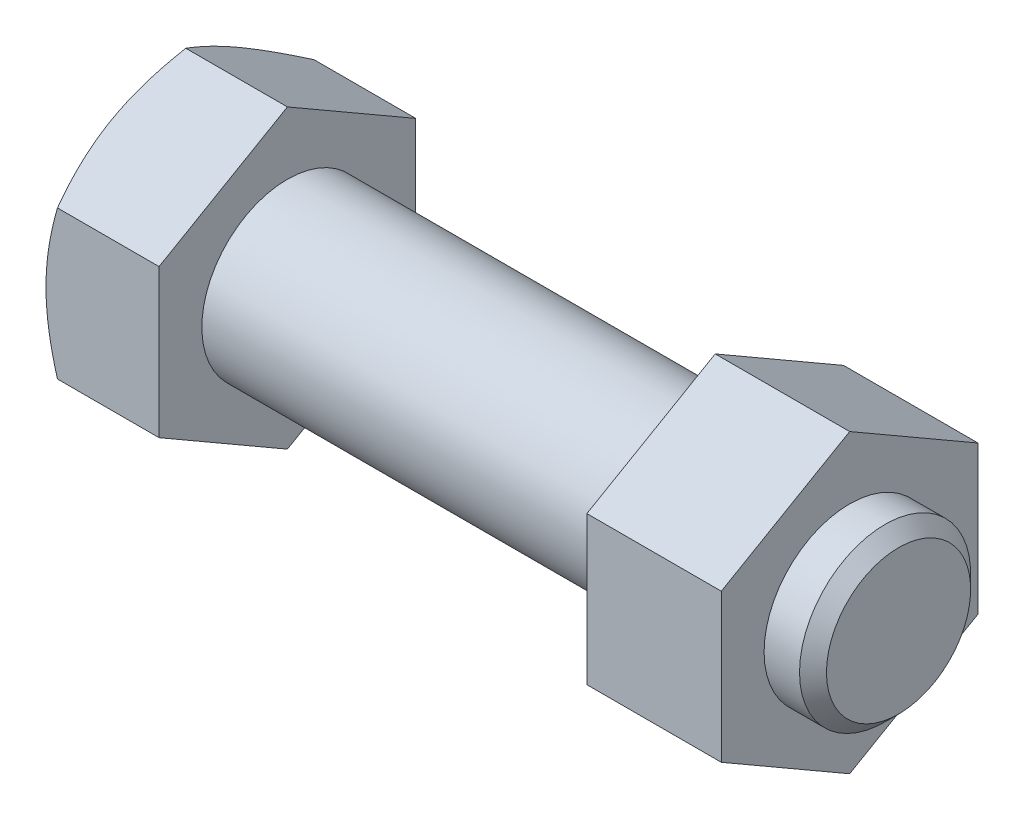
ISO-10303-21;
HEADER;
FILE_DESCRIPTION(('STEP AP214'),'2;1');
FILE_NAME('part.step','',(''),(''),'','','');
FILE_SCHEMA(('AUTOMOTIVE_DESIGN { 1 0 10303 214 1 1 1 1 }'));
ENDSEC;
DATA;
#1=APPLICATION_CONTEXT('core data for automotive mechanical design processes');
#2=APPLICATION_PROTOCOL_DEFINITION('international standard','automotive_design',2000,#1);
#3=PRODUCT_CONTEXT('',#1,'mechanical');
#4=PRODUCT('Part','Part','',(#3));
#5=PRODUCT_RELATED_PRODUCT_CATEGORY('part','',(#4));
#6=PRODUCT_DEFINITION_FORMATION('','',#4);
#7=PRODUCT_DEFINITION_CONTEXT('part definition',#1,'design');
#8=PRODUCT_DEFINITION('design','',#6,#7);
#9=PRODUCT_DEFINITION_SHAPE('','',#8);
#10=(LENGTH_UNIT() NAMED_UNIT(*) SI_UNIT(.MILLI.,.METRE.));
#11=(NAMED_UNIT(*) PLANE_ANGLE_UNIT() SI_UNIT($,.RADIAN.));
#12=(NAMED_UNIT(*) SI_UNIT($,.STERADIAN.) SOLID_ANGLE_UNIT());
#13=UNCERTAINTY_MEASURE_WITH_UNIT(LENGTH_MEASURE(1.E-05),#10,'distance_accuracy_value','');
#14=(GEOMETRIC_REPRESENTATION_CONTEXT(3) GLOBAL_UNCERTAINTY_ASSIGNED_CONTEXT((#13)) GLOBAL_UNIT_ASSIGNED_CONTEXT((#10,
#11,#12)) REPRESENTATION_CONTEXT('',''));
#15=CARTESIAN_POINT('',(0.,0.,0.));
#16=DIRECTION('',(0.,0.,1.));
#17=DIRECTION('',(1.,0.,0.));
#18=AXIS2_PLACEMENT_3D('',#15,#16,#17);
#19=CARTESIAN_POINT('',(0.,0.,0.));
#20=DIRECTION('',(-1.,0.,0.));
#21=DIRECTION('',(0.,0.,1.00000000000005));
#22=AXIS2_PLACEMENT_3D('',#19,#20,#21);
#23=CYLINDRICAL_SURFACE('',#22,7.);
#24=CARTESIAN_POINT('',(9.24999999999998,-1.33226762955019E-12,9.71445146547012E-13));
#25=DIRECTION('',(1.,0.,0.));
#26=DIRECTION('',(0.,0.,-1.00000000000005));
#27=AXIS2_PLACEMENT_3D('',#24,#25,#26);
#28=CIRCLE('',#27,7.);
#29=CARTESIAN_POINT('',(9.24999999999998,-1.53393964197335E-12,-6.99999999999936));
#30=VERTEX_POINT('',#29);
#31=EDGE_CURVE('E276',#30,#30,#28,.F.);
#32=ORIENTED_EDGE('',*,*,#31,.F.);
#33=EDGE_LOOP('',(#32));
#34=FACE_BOUND('',#33,.T.);
#35=CARTESIAN_POINT('',(44.2499999999999,-1.13797860024079E-12,1.83186799063151E-12));
#36=DIRECTION('',(1.,0.,0.));
#37=DIRECTION('',(0.,1.00000000000003,0.));
#38=AXIS2_PLACEMENT_3D('',#35,#36,#37);
#39=CIRCLE('',#38,7.);
#40=CARTESIAN_POINT('',(44.2499999999999,6.99999999999906,2.02421412964782E-12));
#41=VERTEX_POINT('',#40);
#42=EDGE_CURVE('E11',#41,#41,#39,.T.);
#43=ORIENTED_EDGE('',*,*,#42,.F.);
#44=EDGE_LOOP('',(#43));
#45=FACE_BOUND('',#44,.T.);
#46=ADVANCED_FACE('F34',(#34,#45),#23,.T.);
#47=CARTESIAN_POINT('',(9.24999999999221,6.06217782648963,-10.4999999999995));
#48=DIRECTION('',(0.,-0.866025403784438,0.500000000000001));
#49=DIRECTION('',(0.,-0.50000000000004,-0.866025403784497));
#50=AXIS2_PLACEMENT_3D('',#47,#48,#49);
#51=PLANE('',#50);
#52=CARTESIAN_POINT('',(0.937888841127998,12.1244711230351,0.000200000001032707));
#53=CARTESIAN_POINT('',(0.860963916074536,11.9912113022024,-0.230612780288469));
#54=CARTESIAN_POINT('',(0.78753038305219,11.857454619267,-0.462286150984406));
#55=CARTESIAN_POINT('',(0.648614855968593,11.5888686248672,-0.927490739486239));
#56=CARTESIAN_POINT('',(0.583135477152079,11.4540389760643,-1.16102254157951));
#57=CARTESIAN_POINT('',(0.399895760204819,11.047377522337,-1.86538084091498));
#58=CARTESIAN_POINT('',(0.295669956057004,10.7739403689782,-2.33898788320942));
#59=CARTESIAN_POINT('',(0.173455649414797,10.3647541884673,-3.04771913760934));
#60=CARTESIAN_POINT('',(0.138641420004542,10.2302276268788,-3.28072597724818));
#61=CARTESIAN_POINT('',(0.0802602632081069,9.96055165836782,-3.74781845628953));
#62=CARTESIAN_POINT('',(0.0566935523018715,9.82540223950779,-3.98190411636847));
#63=CARTESIAN_POINT('',(0.0214112687989164,9.55487796759049,-4.45046590000994));
#64=CARTESIAN_POINT('',(0.00968161306869788,9.41950357481841,-4.68494122633517));
#65=CARTESIAN_POINT('',(-0.00167731742442949,9.1486297507214,-5.15410845211112));
#66=CARTESIAN_POINT('',(-0.00130696605000955,9.01313032338912,-5.38880034464639));
#67=CARTESIAN_POINT('',(0.0106922674925709,8.75981159789982,-5.82756124770255));
#68=CARTESIAN_POINT('',(0.0208573916334624,8.64197441901355,-6.03166122855481));
#69=CARTESIAN_POINT('',(0.0501416022106179,8.40657565829971,-6.43938384215042));
#70=CARTESIAN_POINT('',(0.0692613220244534,8.28901409655837,-6.6430064401034));
#71=CARTESIAN_POINT('',(0.139600342171741,7.93678493717226,-7.25308524006716));
#72=CARTESIAN_POINT('',(0.203790739707198,7.70274080802523,-7.65846156296314));
#73=CARTESIAN_POINT('',(0.364267089687421,7.23216993554886,-8.47351422265434));
#74=CARTESIAN_POINT('',(0.461233267874081,6.99570324614058,-8.88308654300709));
#75=CARTESIAN_POINT('',(0.681306134880185,6.52629611674948,-9.69612354054741));
#76=CARTESIAN_POINT('',(0.80436113727997,6.29334966603523,-10.0995986286272));
#77=CARTESIAN_POINT('',(0.937888841120227,6.062062356436,-10.5001999999989));
#78=B_SPLINE_CURVE_WITH_KNOTS('',3,(#52,#53,#54,#55,#56,#57,#58,#59,#60,#61,#62,#63,#64,#65,#66,
#67,#68,#69,#70,#71,#72,#73,#74,#75,#76,#77),.UNSPECIFIED.,.F.,.F.,(4,2,2,2,2,2,2,2,2,2,2,2,4),
(0.,0.832130250859885,1.66453336135389,3.3328830853273,4.14658222524611,4.9602970257253,
5.77304256378662,6.58576298988494,7.29326708484919,8.00082123064041,9.41693497455916,
10.864454487817,12.309132577534),.UNSPECIFIED.);
#79=CARTESIAN_POINT('',(0.937822173509018,12.1243556529814,8.60422844084496E-13));
#80=VERTEX_POINT('',#79);
#81=CARTESIAN_POINT('',(0.,9.09326673973612,-5.24999999999859));
#82=VERTEX_POINT('',#81);
#83=EDGE_CURVE('E51',#80,#82,#78,.T.);
#84=ORIENTED_EDGE('',*,*,#83,.F.);
#85=DIRECTION('',(-1.,0.,0.));
#86=VECTOR('',#85,1.);
#87=CARTESIAN_POINT('',(9.24999999999998,12.1243556529811,2.22044604925031E-12));
#88=LINE('',#87,#86);
#89=CARTESIAN_POINT('',(9.24999999999998,12.1243556529811,2.22044604925031E-12));
#90=VERTEX_POINT('',#89);
#91=EDGE_CURVE('E312',#90,#80,#88,.T.);
#92=ORIENTED_EDGE('',*,*,#91,.F.);
#93=DIRECTION('',(0.,0.50000000000004,0.866025403784497));
#94=VECTOR('',#93,1.);
#95=CARTESIAN_POINT('',(9.24999999999221,6.06217782648963,-10.4999999999995));
#96=LINE('',#95,#94);
#97=CARTESIAN_POINT('',(9.24999999999221,6.06217782648963,-10.4999999999995));
#98=VERTEX_POINT('',#97);
#99=EDGE_CURVE('E280',#98,#90,#96,.T.);
#100=ORIENTED_EDGE('',*,*,#99,.F.);
#101=DIRECTION('',(-1.,0.,0.));
#102=VECTOR('',#101,1.);
#103=CARTESIAN_POINT('',(9.24999999999221,6.06217782648963,-10.4999999999995));
#104=LINE('',#103,#102);
#105=CARTESIAN_POINT('',(0.937822173501246,6.06217782648977,-10.4999999999994));
#106=VERTEX_POINT('',#105);
#107=EDGE_CURVE('E297',#98,#106,#104,.T.);
#108=ORIENTED_EDGE('',*,*,#107,.T.);
#109=EDGE_CURVE('E228',#82,#106,#78,.T.);
#110=ORIENTED_EDGE('',*,*,#109,.F.);
#111=EDGE_LOOP('',(#84,#92,#100,#108,#110));
#112=FACE_BOUND('',#111,.T.);
#113=ADVANCED_FACE('F36',(#112),#51,.F.);
#114=CARTESIAN_POINT('',(9.24999999999998,12.1243556529811,2.22044604925031E-12));
#115=DIRECTION('',(0.,-0.866025403784473,-0.500000000000049));
#116=DIRECTION('',(0.,0.49999999999999,-0.866025403784463));
#117=AXIS2_PLACEMENT_3D('',#114,#115,#116);
#118=PLANE('',#117);
#119=CARTESIAN_POINT('',(0.937888841127998,6.06206235643614,10.5002000000026));
#120=CARTESIAN_POINT('',(0.86096391607531,6.1953221772686,10.2693872197127));
#121=CARTESIAN_POINT('',(0.787530383053285,6.32907886020394,10.0377138490166));
#122=CARTESIAN_POINT('',(0.648614855969909,6.59766485460372,9.57250926051456));
#123=CARTESIAN_POINT('',(0.583135477153295,6.73249450340664,9.33897745842131));
#124=CARTESIAN_POINT('',(0.399895760205844,7.13915595713402,8.63461915908581));
#125=CARTESIAN_POINT('',(0.295669956058051,7.41259311049288,8.16101211679126));
#126=CARTESIAN_POINT('',(0.173455649415842,7.8217792910038,7.45228086239129));
#127=CARTESIAN_POINT('',(0.138641420005583,7.95630585259229,7.21927402275248));
#128=CARTESIAN_POINT('',(0.0802602632090827,8.22598182110329,6.75218154371118));
#129=CARTESIAN_POINT('',(0.0566935523027869,8.36113123996333,6.51809588363227));
#130=CARTESIAN_POINT('',(0.0214112687999271,8.63165551188059,6.04953409999081));
#131=CARTESIAN_POINT('',(0.00968161306986368,8.76702990465262,5.81505877366559));
#132=CARTESIAN_POINT('',(-0.00167731742378216,9.03790372874973,5.34589154788974));
#133=CARTESIAN_POINT('',(-0.00130696605003632,9.17340315608215,5.11119965535459));
#134=CARTESIAN_POINT('',(0.0106922674925956,9.42672188157143,4.67243875229843));
#135=CARTESIAN_POINT('',(0.0208573916340453,9.54455906045758,4.46833877144609));
#136=CARTESIAN_POINT('',(0.0501416022115889,9.77995782117137,4.06061615785038));
#137=CARTESIAN_POINT('',(0.0692613220252547,9.89751938291277,3.85699355989737));
#138=CARTESIAN_POINT('',(0.139600342172312,10.249748542299,3.24691475993354));
#139=CARTESIAN_POINT('',(0.203790739707989,10.483792671446,2.84153843703752));
#140=CARTESIAN_POINT('',(0.364267089687928,10.9543635439226,2.02648577734603));
#141=CARTESIAN_POINT('',(0.461233267874075,11.1908302333311,1.61691345699303));
#142=CARTESIAN_POINT('',(0.681306134881522,11.6602373627221,0.803876459452636));
#143=CARTESIAN_POINT('',(0.80436113728316,11.8931838134362,0.400401371372996));
#144=CARTESIAN_POINT('',(0.937888841127998,12.1244711230346,-0.000199999997951839));
#145=B_SPLINE_CURVE_WITH_KNOTS('',3,(#119,#120,#121,#122,#123,#124,#125,#126,#127,#128,#129,
#130,#131,#132,#133,#134,#135,#136,#137,#138,#139,#140,#141,#142,#143,#144),.UNSPECIFIED.,.F.,
.F.,(4,2,2,2,2,2,2,2,2,2,2,2,4),(0.,0.832130250859954,1.66453336135407,3.33288308532775,
4.14658222524648,4.96029702572563,5.77304256378688,6.58576298988512,7.29326708484946,
8.00082123064081,9.41693497455977,10.8644544878181,12.3091325775358),.UNSPECIFIED.);
#146=CARTESIAN_POINT('',(0.937822173509018,6.06217782649024,10.5000000000019));
#147=VERTEX_POINT('',#146);
#148=CARTESIAN_POINT('',(0.,9.09326673973604,5.25000000000295));
#149=VERTEX_POINT('',#148);
#150=EDGE_CURVE('E59',#147,#149,#145,.T.);
#151=ORIENTED_EDGE('',*,*,#150,.F.);
#152=DIRECTION('',(-1.,0.,0.));
#153=VECTOR('',#152,1.);
#154=CARTESIAN_POINT('',(9.24999999999998,6.06217782649035,10.5000000000021));
#155=LINE('',#154,#153);
#156=CARTESIAN_POINT('',(9.24999999999998,6.06217782649035,10.5000000000021));
#157=VERTEX_POINT('',#156);
#158=EDGE_CURVE('E309',#157,#147,#155,.T.);
#159=ORIENTED_EDGE('',*,*,#158,.F.);
#160=DIRECTION('',(0.,-0.49999999999999,0.866025403784463));
#161=VECTOR('',#160,1.);
#162=CARTESIAN_POINT('',(9.24999999999998,12.1243556529811,2.22044604925031E-12));
#163=LINE('',#162,#161);
#164=EDGE_CURVE('E287',#90,#157,#163,.T.);
#165=ORIENTED_EDGE('',*,*,#164,.F.);
#166=ORIENTED_EDGE('',*,*,#91,.T.);
#167=EDGE_CURVE('E225',#149,#80,#145,.T.);
#168=ORIENTED_EDGE('',*,*,#167,.F.);
#169=EDGE_LOOP('',(#151,#159,#165,#166,#168));
#170=FACE_BOUND('',#169,.T.);
#171=ADVANCED_FACE('F244',(#170),#118,.F.);
#172=CARTESIAN_POINT('',(9.24999999999998,6.06217782649035,10.5000000000021));
#173=DIRECTION('',(0.,0.,-1.00000000000005));
#174=DIRECTION('',(0.,1.00000000000003,0.));
#175=AXIS2_PLACEMENT_3D('',#172,#173,#174);
#176=PLANE('',#175);
#177=CARTESIAN_POINT('',(5.2204744599651,-16.4816482140586,10.5000000000023));
#178=CARTESIAN_POINT('',(5.10841571171111,-16.2515114735588,10.5000000000026));
#179=CARTESIAN_POINT('',(4.996900955306,-16.0211099745539,10.5000000000027));
#180=CARTESIAN_POINT('',(4.77508224782035,-15.5597222802319,10.5000000000027));
#181=CARTESIAN_POINT('',(4.66477830832524,-15.3287360793462,10.5000000000027));
#182=CARTESIAN_POINT('',(4.33583913311993,-14.6347588203238,10.5000000000027));
#183=CARTESIAN_POINT('',(4.1192083146535,-14.1708141864084,10.5000000000027));
#184=CARTESIAN_POINT('',(3.69144021647088,-13.2374542365541,10.5000000000026));
#185=CARTESIAN_POINT('',(3.48033759582141,-12.7680229989899,10.5000000000026));
#186=CARTESIAN_POINT('',(3.06650722260737,-11.8254960891295,10.5000000000026));
#187=CARTESIAN_POINT('',(2.86377908729989,-11.352400585479,10.5000000000026));
#188=CARTESIAN_POINT('',(2.46224554950943,-10.3857558923929,10.5000000000026));
#189=CARTESIAN_POINT('',(2.26380321740519,-9.89205511876599,10.5000000000025));
#190=CARTESIAN_POINT('',(1.88146297253892,-8.89894764183918,10.5000000000025));
#191=CARTESIAN_POINT('',(1.69756666425674,-8.3995403160195,10.5000000000024));
#192=CARTESIAN_POINT('',(1.3490048522307,-7.39511365326117,10.5000000000025));
#193=CARTESIAN_POINT('',(1.18430206101421,-6.89010735786051,10.5000000000026));
#194=CARTESIAN_POINT('',(0.879270894971747,-5.87280589755267,10.5000000000022));
#195=CARTESIAN_POINT('',(0.738935048658234,-5.36051301919731,10.5000000000017));
#196=CARTESIAN_POINT('',(0.552073744608922,-4.58793726300956,10.500000000002));
#197=CARTESIAN_POINT('',(0.493860241163225,-4.33046551050846,10.5000000000023));
#198=CARTESIAN_POINT('',(0.385986916269248,-3.81372703405976,10.5000000000025));
#199=CARTESIAN_POINT('',(0.336326929052351,-3.55446034499967,10.5000000000024));
#200=CARTESIAN_POINT('',(0.246424565908829,-3.03429646607666,10.5000000000023));
#201=CARTESIAN_POINT('',(0.206181997424518,-2.77339930966386,10.5000000000023));
#202=CARTESIAN_POINT('',(0.135909252261863,-2.25023434858988,10.5000000000023));
#203=CARTESIAN_POINT('',(0.105878663333516,-1.98796659969258,10.5000000000023));
#204=CARTESIAN_POINT('',(0.0570143132391598,-1.46593685398602,10.5000000000023));
#205=CARTESIAN_POINT('',(0.0380355913872968,-1.20618851046206,10.5000000000022));
#206=CARTESIAN_POINT('',(0.0110886529054471,-0.686121830921128,10.5000000000023));
#207=CARTESIAN_POINT('',(0.00312024799880134,-0.425803504727109,10.5000000000024));
#208=CARTESIAN_POINT('',(-0.00161548269204034,0.0949369886880636,10.5000000000021));
#209=CARTESIAN_POINT('',(0.0016171740738261,0.355359155746814,10.5000000000017));
#210=CARTESIAN_POINT('',(0.0192021822592382,0.875830522582094,10.5000000000027));
#211=CARTESIAN_POINT('',(0.0335550415991761,1.1358797047788,10.5000000000041));
#212=CARTESIAN_POINT('',(0.0806524760624566,1.75496707583186,10.5000000000047));
#213=CARTESIAN_POINT('',(0.118345532370611,2.11363731181991,10.5000000000029));
#214=CARTESIAN_POINT('',(0.212873234931461,2.8284272831368,10.5000000000015));
#215=CARTESIAN_POINT('',(0.269710320925771,3.18454668747356,10.5000000000019));
#216=CARTESIAN_POINT('',(0.465933295547018,4.24861014213878,10.5000000000026));
#217=CARTESIAN_POINT('',(0.630998761834848,4.95188760375613,10.5000000000022));
#218=CARTESIAN_POINT('',(0.918660194090024,6.00372345479824,10.500000000002));
#219=CARTESIAN_POINT('',(1.02259898965318,6.35769943645435,10.500000000002));
#220=CARTESIAN_POINT('',(1.24163072977531,7.06221736873109,10.5000000000021));
#221=CARTESIAN_POINT('',(1.35672375176091,7.41275929549576,10.5000000000022));
#222=CARTESIAN_POINT('',(1.59618779282117,8.11051221625556,10.5000000000019));
#223=CARTESIAN_POINT('',(1.72055601508275,8.45772417900184,10.5000000000015));
#224=CARTESIAN_POINT('',(1.97707156080202,9.14924773243234,10.5000000000025));
#225=CARTESIAN_POINT('',(2.1092187686581,9.49355936613077,10.500000000004));
#226=CARTESIAN_POINT('',(2.44296998758986,10.3391184043909,10.5000000000047));
#227=CARTESIAN_POINT('',(2.64829832241045,10.8388935045455,10.5000000000027));
#228=CARTESIAN_POINT('',(3.06975629526361,11.8338834048278,10.5000000000012));
#229=CARTESIAN_POINT('',(3.28588675525545,12.329097854519,10.5000000000017));
#230=CARTESIAN_POINT('',(3.72667156109492,13.3158710243288,10.500000000002));
#231=CARTESIAN_POINT('',(3.95132823824101,13.8074287000004,10.5000000000019));
#232=CARTESIAN_POINT('',(4.40735039706895,14.7873974223825,10.5000000000018));
#233=CARTESIAN_POINT('',(4.63871569859564,15.2758085531615,10.5000000000018));
#234=CARTESIAN_POINT('',(5.10713604015522,16.2506551575301,10.5000000000018));
#235=CARTESIAN_POINT('',(5.34419794777359,16.7370873249503,10.5000000000018));
#236=CARTESIAN_POINT('',(5.82271335290449,17.7077867337493,10.5000000000017));
#237=CARTESIAN_POINT('',(6.06416687416752,18.1920539634021,10.5000000000017));
#238=CARTESIAN_POINT('',(6.55064006057443,19.1586956492883,10.5000000000017));
#239=CARTESIAN_POINT('',(6.79565915421385,19.641070393458,10.5000000000017));
#240=CARTESIAN_POINT('',(7.28869163212541,20.604288092544,10.5000000000016));
#241=CARTESIAN_POINT('',(7.53670502871419,21.0851310411491,10.5000000000016));
#242=CARTESIAN_POINT('',(8.23932373085691,22.4387066917281,10.5000000000016));
#243=CARTESIAN_POINT('',(8.6968093241447,23.3099441586517,10.5000000000016));
#244=CARTESIAN_POINT('',(9.61789414324444,25.0492220911523,10.5000000000015));
#245=CARTESIAN_POINT('',(10.0814936344982,25.9172624158148,10.5000000000014));
#246=CARTESIAN_POINT('',(11.0120158407311,27.6483953506365,10.5000000000015));
#247=CARTESIAN_POINT('',(11.4789254491467,28.511495010712,10.5000000000016));
#248=CARTESIAN_POINT('',(12.181966273783,29.8046526006505,10.5000000000013));
#249=CARTESIAN_POINT('',(12.416751950406,30.2354431241629,10.5000000000011));
#250=CARTESIAN_POINT('',(12.8871248069561,31.0965855728262,10.5000000000016));
#251=CARTESIAN_POINT('',(13.1227119856787,31.5269374986348,10.5000000000022));
#252=CARTESIAN_POINT('',(13.3586525810192,31.957095630733,10.5000000000037));
#253=B_SPLINE_CURVE_WITH_KNOTS('',3,(#177,#178,#179,#180,#181,#182,#183,#184,#185,#186,#187,
#188,#189,#190,#191,#192,#193,#194,#195,#196,#197,#198,#199,#200,#201,#202,#203,#204,#205,#206,
#207,#208,#209,#210,#211,#212,#213,#214,#215,#216,#217,#218,#219,#220,#221,#222,#223,#224,#225,
#226,#227,#228,#229,#230,#231,#232,#233,#234,#235,#236,#237,#238,#239,#240,#241,#242,#243,#244,
#245,#246,#247,#248,#249,#250,#251,#252),.UNSPECIFIED.,.F.,.F.,(4,2,2,2,2,2,2,2,2,2,2,2,2,2,2,2,
2,2,2,2,2,2,2,2,2,2,2,2,2,2,2,2,2,2,2,2,2,4),(0.,0.767905398539467,1.53581813821227,
3.07186087436249,4.6159375847509,6.15994364724962,7.75603870055433,9.352309564206,
10.9454257273444,12.5380525370384,13.3298454796385,14.121623075428,14.9133844803492,
15.7051139186571,16.4862101446179,17.2672930136509,18.0483746658491,18.8294919964162,
19.9108211856369,20.9922882331183,23.1563369158174,24.263000525284,25.3696718171631,
26.476010745881,27.5823332377137,29.2030865736206,30.8239634248039,32.4452867064975,
34.0665664889998,35.6899099961937,37.3132622852867,38.9363571817753,40.559458756909,
43.5115615357748,46.4637929082344,49.4076749676313,50.8795245740015,52.3513719698297),.UNSPECIFIED.);
#254=CARTESIAN_POINT('',(0.937822173509018,-6.06217782649235,10.5000000000018));
#255=VERTEX_POINT('',#254);
#256=CARTESIAN_POINT('',(0.,-8.88178419700125E-13,10.500000000002));
#257=VERTEX_POINT('',#256);
#258=EDGE_CURVE('E283',#255,#257,#253,.T.);
#259=ORIENTED_EDGE('',*,*,#258,.F.);
#260=DIRECTION('',(-1.,0.,0.));
#261=VECTOR('',#260,1.);
#262=CARTESIAN_POINT('',(9.24999999999998,-6.06217782649226,10.500000000002));
#263=LINE('',#262,#261);
#264=CARTESIAN_POINT('',(9.24999999999998,-6.06217782649226,10.500000000002));
#265=VERTEX_POINT('',#264);
#266=EDGE_CURVE('E306',#265,#255,#263,.T.);
#267=ORIENTED_EDGE('',*,*,#266,.F.);
#268=DIRECTION('',(0.,-1.00000000000003,0.));
#269=VECTOR('',#268,1.);
#270=CARTESIAN_POINT('',(9.24999999999998,6.06217782649035,10.5000000000021));
#271=LINE('',#270,#269);
#272=EDGE_CURVE('E289',#157,#265,#271,.T.);
#273=ORIENTED_EDGE('',*,*,#272,.F.);
#274=ORIENTED_EDGE('',*,*,#158,.T.);
#275=EDGE_CURVE('E238',#257,#147,#253,.T.);
#276=ORIENTED_EDGE('',*,*,#275,.F.);
#277=EDGE_LOOP('',(#259,#267,#273,#274,#276));
#278=FACE_BOUND('',#277,.T.);
#279=ADVANCED_FACE('F215',(#278),#176,.F.);
#280=CARTESIAN_POINT('',(9.24999999999221,-12.1243556529839,3.33066907387547E-13));
#281=DIRECTION('',(0.,0.866025403784437,-0.500000000000002));
#282=DIRECTION('',(0.,0.500000000000039,0.866025403784498));
#283=AXIS2_PLACEMENT_3D('',#280,#281,#282);
#284=PLANE('',#283);
#285=CARTESIAN_POINT('',(0.937888841120227,-12.1244711230376,-0.000199999999117573));
#286=CARTESIAN_POINT('',(0.860963916072215,-11.9912113022042,0.23061278029163));
#287=CARTESIAN_POINT('',(0.787530383052209,-11.8574546192685,0.462286150988073));
#288=CARTESIAN_POINT('',(0.64861485597043,-11.5888686248684,0.927490739490288));
#289=CARTESIAN_POINT('',(0.583135477153395,-11.4540389760656,1.16102254158343));
#290=CARTESIAN_POINT('',(0.399895760205332,-11.0473775223384,1.86538084091887));
#291=CARTESIAN_POINT('',(0.295669956058047,-10.7739403689794,2.3389878832136));
#292=CARTESIAN_POINT('',(0.17345564941617,-10.3647541884684,3.04771913761374));
#293=CARTESIAN_POINT('',(0.138641420005952,-10.2302276268798,3.2807259772526));
#294=CARTESIAN_POINT('',(0.0802602632095063,-9.96055165836883,3.74781845629409));
#295=CARTESIAN_POINT('',(0.0566935523032264,-9.82540223950883,3.98190411637314));
#296=CARTESIAN_POINT('',(0.0214112688006747,-9.55487796759127,4.45046590001459));
#297=CARTESIAN_POINT('',(0.00968161307090166,-9.41950357481891,4.68494122633969));
#298=CARTESIAN_POINT('',(-0.00167731742318811,-9.14862975072263,5.15410845211611));
#299=CARTESIAN_POINT('',(-0.00130696605017731,-9.01313032339135,5.38880034465198));
#300=CARTESIAN_POINT('',(0.0106922674927158,-8.75981159790195,5.82756124770798));
#301=CARTESIAN_POINT('',(0.0208573916349454,-8.64197441901482,6.03166122855963));
#302=CARTESIAN_POINT('',(0.0501416022131474,-8.40657565830035,6.43938384215475));
#303=CARTESIAN_POINT('',(0.0692613220266922,-8.28901409655924,6.64300644010785));
#304=CARTESIAN_POINT('',(0.139600342173602,-7.93678493717351,7.25308524007179));
#305=CARTESIAN_POINT('',(0.203790739709466,-7.70274080802636,7.65846156296762));
#306=CARTESIAN_POINT('',(0.364267089689735,-7.23216993554978,8.47351422265877));
#307=CARTESIAN_POINT('',(0.461233267876019,-6.99570324614142,8.88308654301161));
#308=CARTESIAN_POINT('',(0.681306134883108,-6.52629611675068,9.69612354055183));
#309=CARTESIAN_POINT('',(0.804361137284247,-6.29334966603686,10.0995986286314));
#310=CARTESIAN_POINT('',(0.937888841127998,-6.06206235643852,10.5002000000025));
#311=B_SPLINE_CURVE_WITH_KNOTS('',3,(#285,#286,#287,#288,#289,#290,#291,#292,#293,#294,#295,
#296,#297,#298,#299,#300,#301,#302,#303,#304,#305,#306,#307,#308,#309,#310),.UNSPECIFIED.,.F.,
.F.,(4,2,2,2,2,2,2,2,2,2,2,2,4),(0.,0.83213025085972,1.66453336135373,3.33288308532765,
4.1465822252466,4.96029702572601,5.77304256378741,6.58576298988574,7.29326708484984,
8.000821230641,9.4169349745597,10.8644544878176,12.3091325775345),.UNSPECIFIED.);
#312=CARTESIAN_POINT('',(0.937822173501246,-12.1243556529837,1.02695629777827E-12));
#313=VERTEX_POINT('',#312);
#314=CARTESIAN_POINT('',(0.,-9.09326673973759,5.25000000000281));
#315=VERTEX_POINT('',#314);
#316=EDGE_CURVE('E219',#313,#315,#311,.T.);
#317=ORIENTED_EDGE('',*,*,#316,.F.);
#318=DIRECTION('',(-1.,0.,0.));
#319=VECTOR('',#318,1.);
#320=CARTESIAN_POINT('',(9.24999999999221,-12.1243556529839,3.33066907387547E-13));
#321=LINE('',#320,#319);
#322=CARTESIAN_POINT('',(9.24999999999221,-12.1243556529839,3.33066907387547E-13));
#323=VERTEX_POINT('',#322);
#324=EDGE_CURVE('E303',#323,#313,#321,.T.);
#325=ORIENTED_EDGE('',*,*,#324,.F.);
#326=DIRECTION('',(0.,-0.50000000000004,-0.866025403784497));
#327=VECTOR('',#326,1.);
#328=CARTESIAN_POINT('',(9.24999999999221,-12.1243556529839,3.33066907387547E-13));
#329=LINE('',#328,#327);
#330=EDGE_CURVE('E291',#265,#323,#329,.T.);
#331=ORIENTED_EDGE('',*,*,#330,.F.);
#332=ORIENTED_EDGE('',*,*,#266,.T.);
#333=EDGE_CURVE('E227',#315,#255,#311,.T.);
#334=ORIENTED_EDGE('',*,*,#333,.F.);
#335=EDGE_LOOP('',(#317,#325,#331,#332,#334));
#336=FACE_BOUND('',#335,.T.);
#337=ADVANCED_FACE('F210',(#336),#284,.F.);
#338=CARTESIAN_POINT('',(9.24999999999998,-6.0621778264931,-10.5000000000002));
#339=DIRECTION('',(0.,0.866025403784474,0.500000000000048));
#340=DIRECTION('',(0.,-0.499999999999988,0.866025403784467));
#341=AXIS2_PLACEMENT_3D('',#338,#339,#340);
#342=PLANE('',#341);
#343=CARTESIAN_POINT('',(0.937888841127998,-6.06206235643905,-10.5002000000001));
#344=CARTESIAN_POINT('',(0.860963916075327,-6.19532217727185,-10.2693872197105));
#345=CARTESIAN_POINT('',(0.787530383053343,-6.32907886020733,-10.0377138490145));
#346=CARTESIAN_POINT('',(0.648614855970068,-6.5976648546072,-9.57250926051258));
#347=CARTESIAN_POINT('',(0.583135477153514,-6.73249450341007,-9.33897745841933));
#348=CARTESIAN_POINT('',(0.399895760206203,-7.13915595713739,-8.63461915908377));
#349=CARTESIAN_POINT('',(0.295669956058487,-7.41259311049629,-8.16101211678918));
#350=CARTESIAN_POINT('',(0.173455649416451,-7.82177929100731,-7.45228086238914));
#351=CARTESIAN_POINT('',(0.138641420006258,-7.95630585259585,-7.2192740227503));
#352=CARTESIAN_POINT('',(0.0802602632098083,-8.22598182110683,-6.75218154370884));
#353=CARTESIAN_POINT('',(0.0566935523034984,-8.36113123996681,-6.51809588362981));
#354=CARTESIAN_POINT('',(0.0214112688009386,-8.63165551188439,-6.04953409998843));
#355=CARTESIAN_POINT('',(0.00968161307118745,-8.76702990465682,-5.81505877366339));
#356=CARTESIAN_POINT('',(-0.00167731742302896,-9.03790372875292,-5.34589154788692));
#357=CARTESIAN_POINT('',(-0.00130696605016677,-9.17340315608396,-5.11119965535094));
#358=CARTESIAN_POINT('',(0.0106922674927061,-9.42672188157337,-4.67243875229502));
#359=CARTESIAN_POINT('',(0.0208573916350299,-9.54455906046068,-4.46833877144353));
#360=CARTESIAN_POINT('',(0.0501416022132881,-9.77995782117528,-4.06061615784857));
#361=CARTESIAN_POINT('',(0.0692613220267952,-9.89751938291633,-3.85699355989547));
#362=CARTESIAN_POINT('',(0.139600342173544,-10.2497485423019,-3.24691475993155));
#363=CARTESIAN_POINT('',(0.203790739709238,-10.4837926714491,-2.84153843703576));
#364=CARTESIAN_POINT('',(0.364267089689788,-10.9543635439257,-2.02648577734485));
#365=CARTESIAN_POINT('',(0.461233267876536,-11.190830233334,-1.61691345699221));
#366=CARTESIAN_POINT('',(0.681306134882092,-11.6602373627247,-0.803876459451749));
#367=CARTESIAN_POINT('',(0.804361137281235,-11.8931838134385,-0.400401371371678));
#368=CARTESIAN_POINT('',(0.937888841120227,-12.1244711230369,0.000200000000644129));
#369=B_SPLINE_CURVE_WITH_KNOTS('',3,(#343,#344,#345,#346,#347,#348,#349,#350,#351,#352,#353,
#354,#355,#356,#357,#358,#359,#360,#361,#362,#363,#364,#365,#366,#367,#368),.UNSPECIFIED.,.F.,
.F.,(4,2,2,2,2,2,2,2,2,2,2,2,4),(0.,0.832130250859809,1.6645333613538,3.33288308532759,
4.14658222524648,4.96029702572582,5.77304256378716,6.58576298988542,7.2932670848494,
8.00082123064045,9.41693497455897,10.8644544878166,12.3091325775332),.UNSPECIFIED.);
#370=CARTESIAN_POINT('',(0.937822173509018,-6.06217782649232,-10.5000000000006));
#371=VERTEX_POINT('',#370);
#372=CARTESIAN_POINT('',(0.,-9.09326673973818,-5.24999999999809));
#373=VERTEX_POINT('',#372);
#374=EDGE_CURVE('E187',#371,#373,#369,.T.);
#375=ORIENTED_EDGE('',*,*,#374,.F.);
#376=DIRECTION('',(-1.,0.,0.));
#377=VECTOR('',#376,1.);
#378=CARTESIAN_POINT('',(9.24999999999998,-6.0621778264931,-10.5000000000002));
#379=LINE('',#378,#377);
#380=CARTESIAN_POINT('',(9.24999999999998,-6.0621778264931,-10.5000000000002));
#381=VERTEX_POINT('',#380);
#382=EDGE_CURVE('E300',#381,#371,#379,.T.);
#383=ORIENTED_EDGE('',*,*,#382,.F.);
#384=DIRECTION('',(0.,0.499999999999988,-0.866025403784467));
#385=VECTOR('',#384,1.);
#386=CARTESIAN_POINT('',(9.24999999999998,-6.0621778264931,-10.5000000000002));
#387=LINE('',#386,#385);
#388=EDGE_CURVE('E293',#323,#381,#387,.T.);
#389=ORIENTED_EDGE('',*,*,#388,.F.);
#390=ORIENTED_EDGE('',*,*,#324,.T.);
#391=EDGE_CURVE('E226',#373,#313,#369,.T.);
#392=ORIENTED_EDGE('',*,*,#391,.F.);
#393=EDGE_LOOP('',(#375,#383,#389,#390,#392));
#394=FACE_BOUND('',#393,.T.);
#395=ADVANCED_FACE('F203',(#394),#342,.F.);
#396=CARTESIAN_POINT('',(9.24999999999221,6.06217782648963,-10.4999999999995));
#397=DIRECTION('',(0.,0.,1.00000000000005));
#398=DIRECTION('',(0.,-1.00000000000003,0.));
#399=AXIS2_PLACEMENT_3D('',#396,#397,#398);
#400=PLANE('',#399);
#401=CARTESIAN_POINT('',(5.22047445997531,-16.4816482140589,-10.5));
#402=CARTESIAN_POINT('',(5.10841571171557,-16.2515114735619,-10.4999999999993));
#403=CARTESIAN_POINT('',(4.99690095530802,-16.0211099745582,-10.499999999999));
#404=CARTESIAN_POINT('',(4.77508224782054,-15.5597222802373,-10.4999999999988));
#405=CARTESIAN_POINT('',(4.66477830832603,-15.3287360793513,-10.4999999999989));
#406=CARTESIAN_POINT('',(4.33583913312171,-14.6347588203286,-10.499999999999));
#407=CARTESIAN_POINT('',(4.11920831465483,-14.1708141864136,-10.499999999999));
#408=CARTESIAN_POINT('',(3.69144021647188,-13.2374542365596,-10.4999999999989));
#409=CARTESIAN_POINT('',(3.48033759582255,-12.7680229989956,-10.499999999999));
#410=CARTESIAN_POINT('',(3.06650722260859,-11.8254960891354,-10.499999999999));
#411=CARTESIAN_POINT('',(2.86377908730107,-11.352400585485,-10.499999999999));
#412=CARTESIAN_POINT('',(2.4622455495103,-10.3857558923986,-10.499999999999));
#413=CARTESIAN_POINT('',(2.26380321740579,-9.89205511877132,-10.499999999999));
#414=CARTESIAN_POINT('',(1.88146297253913,-8.89894764184366,-10.4999999999991));
#415=CARTESIAN_POINT('',(1.69756666425683,-8.39954031602354,-10.4999999999992));
#416=CARTESIAN_POINT('',(1.34900485223007,-7.39511365326448,-10.499999999999));
#417=CARTESIAN_POINT('',(1.18430206101299,-6.89010735786352,-10.4999999999987));
#418=CARTESIAN_POINT('',(0.879270894971216,-5.87280589755456,-10.4999999999997));
#419=CARTESIAN_POINT('',(0.738935048658984,-5.36051301919838,-10.5000000000011));
#420=CARTESIAN_POINT('',(0.552073744608591,-4.58793726301032,-10.5000000000003));
#421=CARTESIAN_POINT('',(0.493860241162056,-4.33046551050935,-10.4999999999995));
#422=CARTESIAN_POINT('',(0.385986916267433,-3.81372703406069,-10.499999999999));
#423=CARTESIAN_POINT('',(0.336326929050726,-3.55446034500049,-10.4999999999992));
#424=CARTESIAN_POINT('',(0.246424565907319,-3.03429646607731,-10.4999999999993));
#425=CARTESIAN_POINT('',(0.206181997422933,-2.77339930966446,-10.4999999999993));
#426=CARTESIAN_POINT('',(0.135909252260182,-2.25023434859032,-10.4999999999993));
#427=CARTESIAN_POINT('',(0.105878663331815,-1.98796659969293,-10.4999999999993));
#428=CARTESIAN_POINT('',(0.0570143132375211,-1.46593685398636,-10.4999999999993));
#429=CARTESIAN_POINT('',(0.0380355913857333,-1.20618851046247,-10.4999999999994));
#430=CARTESIAN_POINT('',(0.011088652903676,-0.686121830921597,-10.4999999999993));
#431=CARTESIAN_POINT('',(0.00312024799674911,-0.425803504727581,-10.4999999999992));
#432=CARTESIAN_POINT('',(-0.00161548269332027,0.0949369886874646,-10.4999999999995));
#433=CARTESIAN_POINT('',(0.00161717407359776,0.355359155746089,-10.4999999999999));
#434=CARTESIAN_POINT('',(0.019202182256135,0.875830522581338,-10.4999999999989));
#435=CARTESIAN_POINT('',(0.0335550415921425,1.13587970477814,-10.4999999999976));
#436=CARTESIAN_POINT('',(0.0806524760536752,1.754967075831,-10.499999999997));
#437=CARTESIAN_POINT('',(0.118345532366947,2.11363731181854,-10.4999999999988));
#438=CARTESIAN_POINT('',(0.212873234931644,2.8284272831351,-10.5000000000001));
#439=CARTESIAN_POINT('',(0.26971032092469,3.18454668747203,-10.4999999999997));
#440=CARTESIAN_POINT('',(0.465933295544024,4.24861014213768,-10.499999999999));
#441=CARTESIAN_POINT('',(0.630998761833081,4.95188760375511,-10.4999999999994));
#442=CARTESIAN_POINT('',(0.918660194088681,6.00372345479771,-10.4999999999996));
#443=CARTESIAN_POINT('',(1.02259898965176,6.35769943645415,-10.4999999999996));
#444=CARTESIAN_POINT('',(1.24163072977432,7.06221736873136,-10.4999999999995));
#445=CARTESIAN_POINT('',(1.35672375176043,7.41275929549618,-10.4999999999994));
#446=CARTESIAN_POINT('',(1.59618779282,8.11051221625689,-10.4999999999998));
#447=CARTESIAN_POINT('',(1.72055601508038,8.45772417900393,-10.5000000000003));
#448=CARTESIAN_POINT('',(1.97707156080352,9.14924773243356,-10.4999999999989));
#449=CARTESIAN_POINT('',(2.10921876866467,9.49355936613035,-10.4999999999969));
#450=CARTESIAN_POINT('',(2.4429699875994,10.3391184043903,-10.4999999999959));
#451=CARTESIAN_POINT('',(2.64829832241347,10.8388935045481,-10.4999999999987));
#452=CARTESIAN_POINT('',(3.06975629526213,11.8338834048331,-10.5000000000007));
#453=CARTESIAN_POINT('',(3.28588675525598,12.3290978545238,-10.5));
#454=CARTESIAN_POINT('',(3.72667156109716,13.3158710243336,-10.4999999999995));
#455=CARTESIAN_POINT('',(3.95132823824293,13.8074287000057,-10.4999999999997));
#456=CARTESIAN_POINT('',(4.40735039707088,14.7873974223885,-10.4999999999999));
#457=CARTESIAN_POINT('',(4.63871569859789,15.2758085531678,-10.4999999999998));
#458=CARTESIAN_POINT('',(5.10713604015793,16.2506551575369,-10.4999999999998));
#459=CARTESIAN_POINT('',(5.34419794777644,16.7370873249573,-10.4999999999998));
#460=CARTESIAN_POINT('',(5.82271335290765,17.7077867337568,-10.4999999999999));
#461=CARTESIAN_POINT('',(6.06416687417084,18.1920539634098,-10.4999999999999));
#462=CARTESIAN_POINT('',(6.5506400605781,19.1586956492965,-10.4999999999999));
#463=CARTESIAN_POINT('',(6.7956591542177,19.6410703934665,-10.4999999999999));
#464=CARTESIAN_POINT('',(7.28869163212963,20.604288092553,-10.5));
#465=CARTESIAN_POINT('',(7.53670502871859,21.0851310411584,-10.5));
#466=CARTESIAN_POINT('',(8.2393237308611,22.4387066917369,-10.5));
#467=CARTESIAN_POINT('',(8.69680932414847,23.3099441586596,-10.5));
#468=CARTESIAN_POINT('',(9.61789414324735,25.0492220911584,-10.5000000000001));
#469=CARTESIAN_POINT('',(10.0814936345006,25.91726241582,-10.5000000000002));
#470=CARTESIAN_POINT('',(11.0120158407327,27.6483953506399,-10.5000000000001));
#471=CARTESIAN_POINT('',(11.478925449148,28.5114950107147,-10.5));
#472=CARTESIAN_POINT('',(12.1819662737836,29.804652600652,-10.5000000000003));
#473=CARTESIAN_POINT('',(12.4167519504064,30.2354431241641,-10.5000000000005));
#474=CARTESIAN_POINT('',(12.8871248069561,31.0965855728266,-10.5));
#475=CARTESIAN_POINT('',(13.1227119856787,31.5269374986348,-10.4999999999992));
#476=CARTESIAN_POINT('',(13.3586525810192,31.9570956307325,-10.4999999999974));
#477=B_SPLINE_CURVE_WITH_KNOTS('',3,(#401,#402,#403,#404,#405,#406,#407,#408,#409,#410,#411,
#412,#413,#414,#415,#416,#417,#418,#419,#420,#421,#422,#423,#424,#425,#426,#427,#428,#429,#430,
#431,#432,#433,#434,#435,#436,#437,#438,#439,#440,#441,#442,#443,#444,#445,#446,#447,#448,#449,
#450,#451,#452,#453,#454,#455,#456,#457,#458,#459,#460,#461,#462,#463,#464,#465,#466,#467,#468,
#469,#470,#471,#472,#473,#474,#475,#476),.UNSPECIFIED.,.F.,.F.,(4,2,2,2,2,2,2,2,2,2,2,2,2,2,2,2,
2,2,2,2,2,2,2,2,2,2,2,2,2,2,2,2,2,2,2,2,2,4),(0.,0.767905398539356,1.53581813821202,
3.07186087436187,4.61593758474991,6.1599436472483,7.75603870055445,9.3523095642075,
10.9454257273472,12.5380525370426,13.329845479643,14.1216230754326,14.913384480354,
15.7051139186622,16.4862101446228,17.2672930136557,18.0483746658537,18.8294919964204,
19.910821185641,20.9922882331226,23.1563369158223,24.2630005252898,25.3696718171698,
26.4760107458885,27.5823332377221,29.2030865736305,30.823963424815,32.4452867065094,
34.0665664890128,35.6899099962076,37.3132622853014,38.936357181791,40.5594587569257,
43.5115615357886,46.4637929082451,49.4076749676394,50.8795245740084,52.3513719698353),.UNSPECIFIED.);
#478=CARTESIAN_POINT('',(0.,-1.0547118733939E-12,-10.4999999999989));
#479=VERTEX_POINT('',#478);
#480=EDGE_CURVE('E186',#106,#479,#477,.F.);
#481=ORIENTED_EDGE('',*,*,#480,.F.);
#482=ORIENTED_EDGE('',*,*,#107,.F.);
#483=DIRECTION('',(0.,1.00000000000003,0.));
#484=VECTOR('',#483,1.);
#485=CARTESIAN_POINT('',(9.24999999999221,6.06217782648963,-10.4999999999995));
#486=LINE('',#485,#484);
#487=EDGE_CURVE('E295',#381,#98,#486,.T.);
#488=ORIENTED_EDGE('',*,*,#487,.F.);
#489=ORIENTED_EDGE('',*,*,#382,.T.);
#490=EDGE_CURVE('E178',#479,#371,#477,.F.);
#491=ORIENTED_EDGE('',*,*,#490,.F.);
#492=EDGE_LOOP('',(#481,#482,#488,#489,#491));
#493=FACE_BOUND('',#492,.T.);
#494=ADVANCED_FACE('F198',(#493),#400,.F.);
#495=CARTESIAN_POINT('',(9.24999999999998,12.1243556529811,2.22044604925031E-12));
#496=DIRECTION('',(1.,0.,0.));
#497=DIRECTION('',(0.,0.,-1.00000000000005));
#498=AXIS2_PLACEMENT_3D('',#495,#496,#497);
#499=PLANE('',#498);
#500=ORIENTED_EDGE('',*,*,#31,.T.);
#501=EDGE_LOOP('',(#500));
#502=FACE_BOUND('',#501,.T.);
#503=ORIENTED_EDGE('',*,*,#99,.T.);
#504=ORIENTED_EDGE('',*,*,#164,.T.);
#505=ORIENTED_EDGE('',*,*,#272,.T.);
#506=ORIENTED_EDGE('',*,*,#330,.T.);
#507=ORIENTED_EDGE('',*,*,#388,.T.);
#508=ORIENTED_EDGE('',*,*,#487,.T.);
#509=EDGE_LOOP('',(#503,#504,#505,#506,#507,#508));
#510=FACE_BOUND('',#509,.T.);
#511=ADVANCED_FACE('F202',(#502,#510),#499,.T.);
#512=CARTESIAN_POINT('',(0.,0.,0.));
#513=DIRECTION('',(1.,0.,0.));
#514=DIRECTION('',(0.,0.,-1.00000000000005));
#515=AXIS2_PLACEMENT_3D('',#512,#513,#514);
#516=CONICAL_SURFACE('',#515,10.5,1.0471975511966);
#517=ORIENTED_EDGE('',*,*,#374,.T.);
#518=CARTESIAN_POINT('',(0.,0.,0.));
#519=DIRECTION('',(1.,0.,0.));
#520=DIRECTION('',(0.,0.,-1.00000000000005));
#521=AXIS2_PLACEMENT_3D('',#518,#519,#520);
#522=CIRCLE('',#521,10.5);
#523=EDGE_CURVE('E315',#373,#479,#522,.T.);
#524=ORIENTED_EDGE('',*,*,#523,.T.);
#525=ORIENTED_EDGE('',*,*,#490,.T.);
#526=EDGE_LOOP('',(#517,#524,#525));
#527=FACE_BOUND('',#526,.T.);
#528=ADVANCED_FACE('F355',(#527),#516,.T.);
#529=ORIENTED_EDGE('',*,*,#316,.T.);
#530=EDGE_CURVE('E317',#315,#373,#522,.T.);
#531=ORIENTED_EDGE('',*,*,#530,.T.);
#532=ORIENTED_EDGE('',*,*,#391,.T.);
#533=EDGE_LOOP('',(#529,#531,#532));
#534=FACE_BOUND('',#533,.T.);
#535=ADVANCED_FACE('F357',(#534),#516,.T.);
#536=ORIENTED_EDGE('',*,*,#258,.T.);
#537=EDGE_CURVE('E322',#257,#315,#522,.T.);
#538=ORIENTED_EDGE('',*,*,#537,.T.);
#539=ORIENTED_EDGE('',*,*,#333,.T.);
#540=EDGE_LOOP('',(#536,#538,#539));
#541=FACE_BOUND('',#540,.T.);
#542=ADVANCED_FACE('F194',(#541),#516,.T.);
#543=ORIENTED_EDGE('',*,*,#275,.T.);
#544=ORIENTED_EDGE('',*,*,#150,.T.);
#545=CARTESIAN_POINT('',(0.,0.,0.));
#546=DIRECTION('',(-1.,0.,0.));
#547=DIRECTION('',(0.,0.,1.00000000000005));
#548=AXIS2_PLACEMENT_3D('',#545,#546,#547);
#549=CIRCLE('',#548,10.5);
#550=EDGE_CURVE('E171',#257,#149,#549,.T.);
#551=ORIENTED_EDGE('',*,*,#550,.F.);
#552=EDGE_LOOP('',(#543,#544,#551));
#553=FACE_BOUND('',#552,.T.);
#554=ADVANCED_FACE('F340',(#553),#516,.T.);
#555=ORIENTED_EDGE('',*,*,#167,.T.);
#556=ORIENTED_EDGE('',*,*,#83,.T.);
#557=EDGE_CURVE('E323',#82,#149,#522,.T.);
#558=ORIENTED_EDGE('',*,*,#557,.T.);
#559=EDGE_LOOP('',(#555,#556,#558));
#560=FACE_BOUND('',#559,.T.);
#561=ADVANCED_FACE('F359',(#560),#516,.T.);
#562=ORIENTED_EDGE('',*,*,#109,.T.);
#563=ORIENTED_EDGE('',*,*,#480,.T.);
#564=EDGE_CURVE('E44',#479,#82,#522,.T.);
#565=ORIENTED_EDGE('',*,*,#564,.T.);
#566=EDGE_LOOP('',(#562,#563,#565));
#567=FACE_BOUND('',#566,.T.);
#568=ADVANCED_FACE('F351',(#567),#516,.T.);
#569=CARTESIAN_POINT('',(0.,12.1243556529818,1.83186799063151E-12));
#570=DIRECTION('',(1.,0.,0.));
#571=DIRECTION('',(0.,0.,-1.00000000000005));
#572=AXIS2_PLACEMENT_3D('',#569,#570,#571);
#573=PLANE('',#572);
#574=ORIENTED_EDGE('',*,*,#564,.F.);
#575=ORIENTED_EDGE('',*,*,#523,.F.);
#576=ORIENTED_EDGE('',*,*,#530,.F.);
#577=ORIENTED_EDGE('',*,*,#537,.F.);
#578=ORIENTED_EDGE('',*,*,#550,.T.);
#579=ORIENTED_EDGE('',*,*,#557,.F.);
#580=EDGE_LOOP('',(#574,#575,#576,#577,#578,#579));
#581=FACE_BOUND('',#580,.T.);
#582=ADVANCED_FACE('F205',(#581),#573,.F.);
#583=CARTESIAN_POINT('',(55.2499999999922,6.0621778264833,-10.499999999987));
#584=DIRECTION('',(0.,-0.866025403784439,0.5));
#585=DIRECTION('',(0.,-0.500000000000039,-0.866025403784497));
#586=AXIS2_PLACEMENT_3D('',#583,#584,#585);
#587=PLANE('',#586);
#588=DIRECTION('',(0.,0.500000000000039,0.866025403784497));
#589=VECTOR('',#588,1.);
#590=CARTESIAN_POINT('',(44.2499999999921,6.06217782648352,-10.4999999999872));
#591=LINE('',#590,#589);
#592=CARTESIAN_POINT('',(44.2499999999921,6.06217782648352,-10.4999999999872));
#593=VERTEX_POINT('',#592);
#594=CARTESIAN_POINT('',(44.2500000000001,12.1243556529691,2.91433543964104E-12));
#595=VERTEX_POINT('',#594);
#596=EDGE_CURVE('E168',#593,#595,#591,.T.);
#597=ORIENTED_EDGE('',*,*,#596,.T.);
#598=DIRECTION('',(-1.,0.,0.));
#599=VECTOR('',#598,1.);
#600=CARTESIAN_POINT('',(55.25,12.1243556529691,3.3584246494911E-12));
#601=LINE('',#600,#599);
#602=CARTESIAN_POINT('',(55.25,12.1243556529691,3.3584246494911E-12));
#603=VERTEX_POINT('',#602);
#604=EDGE_CURVE('E148',#603,#595,#601,.T.);
#605=ORIENTED_EDGE('',*,*,#604,.F.);
#606=DIRECTION('',(0.,0.500000000000039,0.866025403784497));
#607=VECTOR('',#606,1.);
#608=CARTESIAN_POINT('',(55.2499999999922,6.0621778264833,-10.499999999987));
#609=LINE('',#608,#607);
#610=CARTESIAN_POINT('',(55.2499999999922,6.0621778264833,-10.499999999987));
#611=VERTEX_POINT('',#610);
#612=EDGE_CURVE('E155',#611,#603,#609,.T.);
#613=ORIENTED_EDGE('',*,*,#612,.F.);
#614=DIRECTION('',(-1.,0.,0.));
#615=VECTOR('',#614,1.);
#616=CARTESIAN_POINT('',(55.2499999999922,6.0621778264833,-10.499999999987));
#617=LINE('',#616,#615);
#618=EDGE_CURVE('E516',#611,#593,#617,.T.);
#619=ORIENTED_EDGE('',*,*,#618,.T.);
#620=EDGE_LOOP('',(#597,#605,#613,#619));
#621=FACE_BOUND('',#620,.T.);
#622=ADVANCED_FACE('F166',(#621),#587,.F.);
#623=CARTESIAN_POINT('',(55.25,12.1243556529691,3.3584246494911E-12));
#624=DIRECTION('',(0.,-0.866025403784474,-0.500000000000048));
#625=DIRECTION('',(0.,0.499999999999989,-0.866025403784462));
#626=AXIS2_PLACEMENT_3D('',#623,#624,#625);
#627=PLANE('',#626);
#628=DIRECTION('',(0.,-0.499999999999988,0.866025403784465));
#629=VECTOR('',#628,1.);
#630=CARTESIAN_POINT('',(44.2500000000001,12.1243556529691,2.91433543964104E-12));
#631=LINE('',#630,#629);
#632=CARTESIAN_POINT('',(44.2500000000001,6.0621778264843,10.4999999999923));
#633=VERTEX_POINT('',#632);
#634=EDGE_CURVE('E502',#595,#633,#631,.T.);
#635=ORIENTED_EDGE('',*,*,#634,.T.);
#636=DIRECTION('',(-1.,0.,0.));
#637=VECTOR('',#636,1.);
#638=CARTESIAN_POINT('',(55.25,6.06217782648458,10.4999999999927));
#639=LINE('',#638,#637);
#640=CARTESIAN_POINT('',(55.25,6.06217782648458,10.4999999999927));
#641=VERTEX_POINT('',#640);
#642=EDGE_CURVE('E151',#641,#633,#639,.T.);
#643=ORIENTED_EDGE('',*,*,#642,.F.);
#644=DIRECTION('',(0.,-0.499999999999988,0.866025403784465));
#645=VECTOR('',#644,1.);
#646=CARTESIAN_POINT('',(55.25,12.1243556529691,3.3584246494911E-12));
#647=LINE('',#646,#645);
#648=EDGE_CURVE('E144',#603,#641,#647,.T.);
#649=ORIENTED_EDGE('',*,*,#648,.F.);
#650=ORIENTED_EDGE('',*,*,#604,.T.);
#651=EDGE_LOOP('',(#635,#643,#649,#650));
#652=FACE_BOUND('',#651,.T.);
#653=ADVANCED_FACE('F146',(#652),#627,.F.);
#654=CARTESIAN_POINT('',(55.25,6.06217782648458,10.4999999999927));
#655=DIRECTION('',(0.,0.,-1.00000000000005));
#656=DIRECTION('',(-1.,0.,0.));
#657=AXIS2_PLACEMENT_3D('',#654,#655,#656);
#658=PLANE('',#657);
#659=DIRECTION('',(0.,-1.00000000000003,0.));
#660=VECTOR('',#659,1.);
#661=CARTESIAN_POINT('',(44.2500000000001,6.0621778264843,10.4999999999923));
#662=LINE('',#661,#660);
#663=CARTESIAN_POINT('',(44.2500000000001,-6.06217782648616,10.4999999999928));
#664=VERTEX_POINT('',#663);
#665=EDGE_CURVE('E496',#633,#664,#662,.T.);
#666=ORIENTED_EDGE('',*,*,#665,.T.);
#667=DIRECTION('',(-1.,0.,0.));
#668=VECTOR('',#667,1.);
#669=CARTESIAN_POINT('',(55.25,-6.06217782648616,10.4999999999919));
#670=LINE('',#669,#668);
#671=CARTESIAN_POINT('',(55.25,-6.06217782648616,10.4999999999919));
#672=VERTEX_POINT('',#671);
#673=EDGE_CURVE('E172',#672,#664,#670,.T.);
#674=ORIENTED_EDGE('',*,*,#673,.F.);
#675=DIRECTION('',(0.,-1.00000000000003,0.));
#676=VECTOR('',#675,1.);
#677=CARTESIAN_POINT('',(55.25,6.06217782648458,10.4999999999927));
#678=LINE('',#677,#676);
#679=EDGE_CURVE('E154',#641,#672,#678,.T.);
#680=ORIENTED_EDGE('',*,*,#679,.F.);
#681=ORIENTED_EDGE('',*,*,#642,.T.);
#682=EDGE_LOOP('',(#666,#674,#680,#681));
#683=FACE_BOUND('',#682,.T.);
#684=ADVANCED_FACE('F465',(#683),#658,.F.);
#685=CARTESIAN_POINT('',(55.25,-6.06217782648616,10.4999999999919));
#686=DIRECTION('',(0.,0.866025403784439,-0.5));
#687=DIRECTION('',(0.,0.500000000000039,0.866025403784497));
#688=AXIS2_PLACEMENT_3D('',#685,#686,#687);
#689=PLANE('',#688);
#690=DIRECTION('',(0.,-0.500000000000039,-0.866025403784497));
#691=VECTOR('',#690,1.);
#692=CARTESIAN_POINT('',(44.2500000000001,-6.06217782648616,10.4999999999928));
#693=LINE('',#692,#691);
#694=CARTESIAN_POINT('',(44.2499999999921,-12.1243556529714,2.22044604925031E-12));
#695=VERTEX_POINT('',#694);
#696=EDGE_CURVE('E501',#664,#695,#693,.T.);
#697=ORIENTED_EDGE('',*,*,#696,.T.);
#698=DIRECTION('',(-1.,0.,0.));
#699=VECTOR('',#698,1.);
#700=CARTESIAN_POINT('',(55.2499999999922,-12.1243556529713,1.41553435639707E-12));
#701=LINE('',#700,#699);
#702=CARTESIAN_POINT('',(55.2499999999922,-12.1243556529713,1.41553435639707E-12));
#703=VERTEX_POINT('',#702);
#704=EDGE_CURVE('E507',#703,#695,#701,.T.);
#705=ORIENTED_EDGE('',*,*,#704,.F.);
#706=DIRECTION('',(0.,-0.500000000000039,-0.866025403784497));
#707=VECTOR('',#706,1.);
#708=CARTESIAN_POINT('',(55.25,-6.06217782648616,10.4999999999919));
#709=LINE('',#708,#707);
#710=EDGE_CURVE('E506',#672,#703,#709,.T.);
#711=ORIENTED_EDGE('',*,*,#710,.F.);
#712=ORIENTED_EDGE('',*,*,#673,.T.);
#713=EDGE_LOOP('',(#697,#705,#711,#712));
#714=FACE_BOUND('',#713,.T.);
#715=ADVANCED_FACE('F457',(#714),#689,.F.);
#716=CARTESIAN_POINT('',(55.2499999999922,-12.1243556529713,1.41553435639707E-12));
#717=DIRECTION('',(0.,0.866025403784474,0.500000000000048));
#718=DIRECTION('',(0.,-0.499999999999988,0.866025403784462));
#719=AXIS2_PLACEMENT_3D('',#716,#717,#718);
#720=PLANE('',#719);
#721=DIRECTION('',(0.,0.49999999999999,-0.866025403784467));
#722=VECTOR('',#721,1.);
#723=CARTESIAN_POINT('',(44.2499999999921,-12.1243556529714,2.22044604925031E-12));
#724=LINE('',#723,#722);
#725=CARTESIAN_POINT('',(44.2499999999999,-6.06217782648671,-10.4999999999873));
#726=VERTEX_POINT('',#725);
#727=EDGE_CURVE('E510',#695,#726,#724,.T.);
#728=ORIENTED_EDGE('',*,*,#727,.T.);
#729=DIRECTION('',(-1.,0.,0.));
#730=VECTOR('',#729,1.);
#731=CARTESIAN_POINT('',(55.25,-6.06217782648658,-10.4999999999875));
#732=LINE('',#731,#730);
#733=CARTESIAN_POINT('',(55.25,-6.06217782648658,-10.4999999999875));
#734=VERTEX_POINT('',#733);
#735=EDGE_CURVE('E518',#734,#726,#732,.T.);
#736=ORIENTED_EDGE('',*,*,#735,.F.);
#737=DIRECTION('',(0.,0.49999999999999,-0.866025403784467));
#738=VECTOR('',#737,1.);
#739=CARTESIAN_POINT('',(55.2499999999922,-12.1243556529713,1.41553435639707E-12));
#740=LINE('',#739,#738);
#741=EDGE_CURVE('E523',#703,#734,#740,.T.);
#742=ORIENTED_EDGE('',*,*,#741,.F.);
#743=ORIENTED_EDGE('',*,*,#704,.T.);
#744=EDGE_LOOP('',(#728,#736,#742,#743));
#745=FACE_BOUND('',#744,.T.);
#746=ADVANCED_FACE('F449',(#745),#720,.F.);
#747=CARTESIAN_POINT('',(55.25,-6.06217782648658,-10.4999999999875));
#748=DIRECTION('',(0.,0.,1.00000000000005));
#749=DIRECTION('',(1.,0.,0.));
#750=AXIS2_PLACEMENT_3D('',#747,#748,#749);
#751=PLANE('',#750);
#752=DIRECTION('',(0.,1.00000000000003,0.));
#753=VECTOR('',#752,1.);
#754=CARTESIAN_POINT('',(44.2499999999999,-6.06217782648671,-10.4999999999873));
#755=LINE('',#754,#753);
#756=EDGE_CURVE('E164',#726,#593,#755,.T.);
#757=ORIENTED_EDGE('',*,*,#756,.T.);
#758=ORIENTED_EDGE('',*,*,#618,.F.);
#759=DIRECTION('',(0.,1.00000000000003,0.));
#760=VECTOR('',#759,1.);
#761=CARTESIAN_POINT('',(55.25,-6.06217782648658,-10.4999999999875));
#762=LINE('',#761,#760);
#763=EDGE_CURVE('E160',#734,#611,#762,.T.);
#764=ORIENTED_EDGE('',*,*,#763,.F.);
#765=ORIENTED_EDGE('',*,*,#735,.T.);
#766=EDGE_LOOP('',(#757,#758,#764,#765));
#767=FACE_BOUND('',#766,.T.);
#768=ADVANCED_FACE('F441',(#767),#751,.F.);
#769=CARTESIAN_POINT('',(55.25,-1.0547118733939E-12,1.72084568816899E-12));
#770=DIRECTION('',(1.,0.,0.));
#771=DIRECTION('',(0.,1.00000000000003,0.));
#772=AXIS2_PLACEMENT_3D('',#769,#770,#771);
#773=PLANE('',#772);
#774=CARTESIAN_POINT('',(55.25,-1.19348975147204E-12,2.3037127760972E-12));
#775=DIRECTION('',(1.,0.,0.));
#776=DIRECTION('',(0.,1.00000000000003,0.));
#777=AXIS2_PLACEMENT_3D('',#774,#775,#776);
#778=CIRCLE('',#777,7.);
#779=CARTESIAN_POINT('',(55.25,6.999999999999,2.49605891511351E-12));
#780=VERTEX_POINT('',#779);
#781=EDGE_CURVE('E39',#780,#780,#778,.T.);
#782=ORIENTED_EDGE('',*,*,#781,.F.);
#783=EDGE_LOOP('',(#782));
#784=FACE_BOUND('',#783,.T.);
#785=ORIENTED_EDGE('',*,*,#612,.T.);
#786=ORIENTED_EDGE('',*,*,#648,.T.);
#787=ORIENTED_EDGE('',*,*,#679,.T.);
#788=ORIENTED_EDGE('',*,*,#710,.T.);
#789=ORIENTED_EDGE('',*,*,#741,.T.);
#790=ORIENTED_EDGE('',*,*,#763,.T.);
#791=EDGE_LOOP('',(#785,#786,#787,#788,#789,#790));
#792=FACE_BOUND('',#791,.T.);
#793=ADVANCED_FACE('F158',(#784,#792),#773,.T.);
#794=CARTESIAN_POINT('',(44.2499999999999,-1.33226762955019E-12,2.08166817117217E-12));
#795=DIRECTION('',(1.,0.,0.));
#796=DIRECTION('',(0.,1.00000000000003,0.));
#797=AXIS2_PLACEMENT_3D('',#794,#795,#796);
#798=PLANE('',#797);
#799=ORIENTED_EDGE('',*,*,#42,.T.);
#800=EDGE_LOOP('',(#799));
#801=FACE_BOUND('',#800,.T.);
#802=ORIENTED_EDGE('',*,*,#596,.F.);
#803=ORIENTED_EDGE('',*,*,#756,.F.);
#804=ORIENTED_EDGE('',*,*,#727,.F.);
#805=ORIENTED_EDGE('',*,*,#696,.F.);
#806=ORIENTED_EDGE('',*,*,#665,.F.);
#807=ORIENTED_EDGE('',*,*,#634,.F.);
#808=EDGE_LOOP('',(#802,#803,#804,#805,#806,#807));
#809=FACE_BOUND('',#808,.T.);
#810=ADVANCED_FACE('F417',(#801,#809),#798,.F.);
#811=CARTESIAN_POINT('',(59.25,-1.0547118733939E-12,2.1094237467878E-12));
#812=DIRECTION('',(-1.,0.,0.));
#813=DIRECTION('',(0.,0.,1.00000000000005));
#814=AXIS2_PLACEMENT_3D('',#811,#812,#813);
#815=PLANE('',#814);
#816=CARTESIAN_POINT('',(59.25,-1.0547118733939E-12,2.1094237467878E-12));
#817=DIRECTION('',(-1.,0.,0.));
#818=DIRECTION('',(0.,0.,1.00000000000005));
#819=AXIS2_PLACEMENT_3D('',#816,#817,#818);
#820=CIRCLE('',#819,5.8985);
#821=CARTESIAN_POINT('',(59.25,-8.84774392639898E-13,5.89850000000239));
#822=VERTEX_POINT('',#821);
#823=EDGE_CURVE('E277',#822,#822,#820,.T.);
#824=ORIENTED_EDGE('',*,*,#823,.F.);
#825=EDGE_LOOP('',(#824));
#826=FACE_BOUND('',#825,.T.);
#827=ADVANCED_FACE('F269',(#826),#815,.F.);
#828=CARTESIAN_POINT('',(59.25,-1.0547118733939E-12,2.1094237467878E-12));
#829=DIRECTION('',(-1.,0.,0.));
#830=DIRECTION('',(0.,0.,1.00000000000005));
#831=AXIS2_PLACEMENT_3D('',#828,#829,#830);
#832=CONICAL_SURFACE('',#831,5.8985,0.785398163397449);
#833=CARTESIAN_POINT('',(58.1484999999999,-1.55431223447522E-12,2.35922392732846E-12));
#834=DIRECTION('',(-1.,0.,0.));
#835=DIRECTION('',(0.,0.,1.00000000000005));
#836=AXIS2_PLACEMENT_3D('',#833,#834,#835);
#837=CIRCLE('',#836,7.);
#838=CARTESIAN_POINT('',(58.1484999999999,-1.35264022205206E-12,7.00000000000269));
#839=VERTEX_POINT('',#838);
#840=EDGE_CURVE('E275',#839,#839,#837,.T.);
#841=ORIENTED_EDGE('',*,*,#840,.F.);
#842=EDGE_LOOP('',(#841));
#843=FACE_BOUND('',#842,.T.);
#844=ORIENTED_EDGE('',*,*,#823,.T.);
#845=EDGE_LOOP('',(#844));
#846=FACE_BOUND('',#845,.T.);
#847=ADVANCED_FACE('F264',(#843,#846),#832,.T.);
#848=ORIENTED_EDGE('',*,*,#781,.T.);
#849=EDGE_LOOP('',(#848));
#850=FACE_BOUND('',#849,.T.);
#851=ORIENTED_EDGE('',*,*,#840,.T.);
#852=EDGE_LOOP('',(#851));
#853=FACE_BOUND('',#852,.T.);
#854=ADVANCED_FACE('F257',(#850,#853),#23,.T.);
#855=CLOSED_SHELL('',(#46,#113,#171,#279,#337,#395,#494,#511,#528,#535,#542,#554,#561,#568,#582,
#622,#653,#684,#715,#746,#768,#793,#810,#827,#847,#854));
#856=MANIFOLD_SOLID_BREP('B2',#855);
#857=ADVANCED_BREP_SHAPE_REPRESENTATION('',(#18,#856),#14);
#858=SHAPE_DEFINITION_REPRESENTATION(#9,#857);
ENDSEC;
END-ISO-10303-21;
